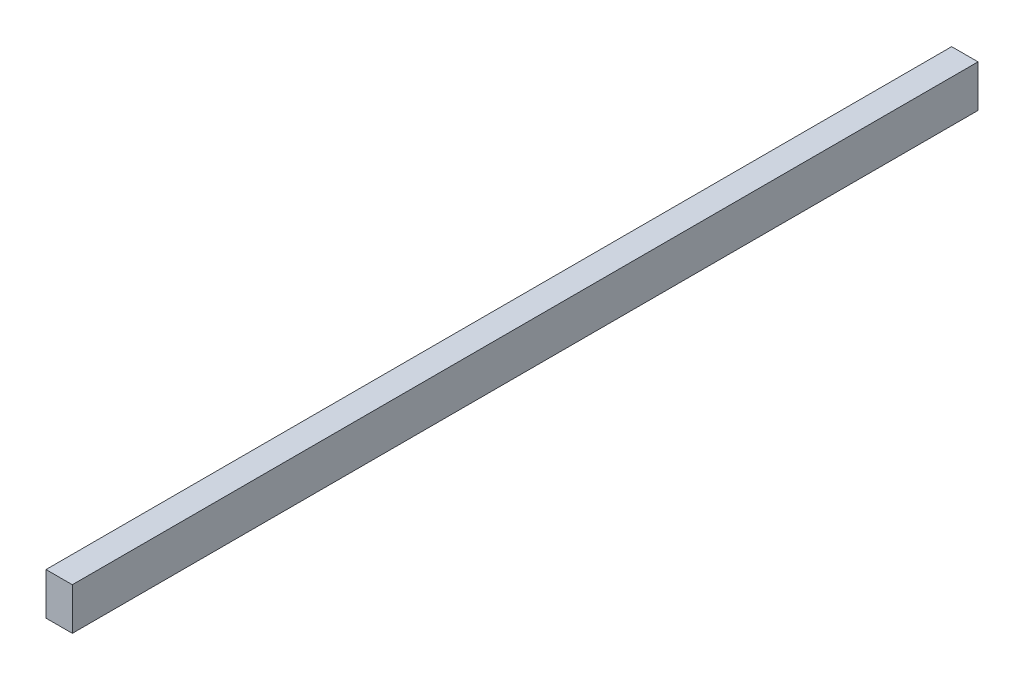
ISO-10303-21;
HEADER;
FILE_DESCRIPTION(('STEP AP214'),'2;1');
FILE_NAME('part.step','',(''),(''),'','','');
FILE_SCHEMA(('AUTOMOTIVE_DESIGN { 1 0 10303 214 1 1 1 1 }'));
ENDSEC;
DATA;
#1=APPLICATION_CONTEXT('core data for automotive mechanical design processes');
#2=APPLICATION_PROTOCOL_DEFINITION('international standard','automotive_design',2000,#1);
#3=PRODUCT_CONTEXT('',#1,'mechanical');
#4=PRODUCT('Part','Part','',(#3));
#5=PRODUCT_RELATED_PRODUCT_CATEGORY('part','',(#4));
#6=PRODUCT_DEFINITION_FORMATION('','',#4);
#7=PRODUCT_DEFINITION_CONTEXT('part definition',#1,'design');
#8=PRODUCT_DEFINITION('design','',#6,#7);
#9=PRODUCT_DEFINITION_SHAPE('','',#8);
#10=(LENGTH_UNIT() NAMED_UNIT(*) SI_UNIT(.MILLI.,.METRE.));
#11=(NAMED_UNIT(*) PLANE_ANGLE_UNIT() SI_UNIT($,.RADIAN.));
#12=(NAMED_UNIT(*) SI_UNIT($,.STERADIAN.) SOLID_ANGLE_UNIT());
#13=UNCERTAINTY_MEASURE_WITH_UNIT(LENGTH_MEASURE(1.E-05),#10,'distance_accuracy_value','');
#14=(GEOMETRIC_REPRESENTATION_CONTEXT(3) GLOBAL_UNCERTAINTY_ASSIGNED_CONTEXT((#13)) GLOBAL_UNIT_ASSIGNED_CONTEXT((#10,
#11,#12)) REPRESENTATION_CONTEXT('',''));
#15=CARTESIAN_POINT('',(0.,0.,0.));
#16=DIRECTION('',(0.,0.,1.));
#17=DIRECTION('',(1.,0.,0.));
#18=AXIS2_PLACEMENT_3D('',#15,#16,#17);
#19=CARTESIAN_POINT('',(12.5,40.,430.));
#20=DIRECTION('',(-1.,0.,0.));
#21=DIRECTION('',(0.,0.,1.));
#22=AXIS2_PLACEMENT_3D('',#19,#20,#21);
#23=PLANE('',#22);
#24=DIRECTION('',(0.,0.,-1.));
#25=VECTOR('',#24,1.);
#26=CARTESIAN_POINT('',(12.5,0.,430.));
#27=LINE('',#26,#25);
#28=CARTESIAN_POINT('',(12.5,0.,430.));
#29=VERTEX_POINT('',#28);
#30=CARTESIAN_POINT('',(12.5,0.,-430.));
#31=VERTEX_POINT('',#30);
#32=EDGE_CURVE('E102',#29,#31,#27,.T.);
#33=ORIENTED_EDGE('',*,*,#32,.T.);
#34=DIRECTION('',(0.,-1.,0.));
#35=VECTOR('',#34,1.);
#36=CARTESIAN_POINT('',(12.5,40.,-430.));
#37=LINE('',#36,#35);
#38=CARTESIAN_POINT('',(12.5,40.,-430.));
#39=VERTEX_POINT('',#38);
#40=EDGE_CURVE('E11',#39,#31,#37,.T.);
#41=ORIENTED_EDGE('',*,*,#40,.F.);
#42=DIRECTION('',(0.,0.,-1.));
#43=VECTOR('',#42,1.);
#44=CARTESIAN_POINT('',(12.5,40.,430.));
#45=LINE('',#44,#43);
#46=CARTESIAN_POINT('',(12.5,40.,430.));
#47=VERTEX_POINT('',#46);
#48=EDGE_CURVE('E90',#47,#39,#45,.T.);
#49=ORIENTED_EDGE('',*,*,#48,.F.);
#50=DIRECTION('',(0.,-1.,0.));
#51=VECTOR('',#50,1.);
#52=CARTESIAN_POINT('',(12.5,40.,430.));
#53=LINE('',#52,#51);
#54=EDGE_CURVE('E98',#47,#29,#53,.T.);
#55=ORIENTED_EDGE('',*,*,#54,.T.);
#56=EDGE_LOOP('',(#33,#41,#49,#55));
#57=FACE_BOUND('',#56,.T.);
#58=ADVANCED_FACE('F39',(#57),#23,.F.);
#59=CARTESIAN_POINT('',(-12.5,40.,-430.));
#60=DIRECTION('',(0.,0.,1.));
#61=DIRECTION('',(1.,0.,0.));
#62=AXIS2_PLACEMENT_3D('',#59,#60,#61);
#63=PLANE('',#62);
#64=DIRECTION('',(-1.,0.,0.));
#65=VECTOR('',#64,1.);
#66=CARTESIAN_POINT('',(-12.5,0.,-430.));
#67=LINE('',#66,#65);
#68=CARTESIAN_POINT('',(-12.5,0.,-430.));
#69=VERTEX_POINT('',#68);
#70=EDGE_CURVE('E94',#31,#69,#67,.T.);
#71=ORIENTED_EDGE('',*,*,#70,.T.);
#72=DIRECTION('',(0.,-1.,0.));
#73=VECTOR('',#72,1.);
#74=CARTESIAN_POINT('',(-12.5,40.,-430.));
#75=LINE('',#74,#73);
#76=CARTESIAN_POINT('',(-12.5,40.,-430.));
#77=VERTEX_POINT('',#76);
#78=EDGE_CURVE('E47',#77,#69,#75,.T.);
#79=ORIENTED_EDGE('',*,*,#78,.F.);
#80=DIRECTION('',(-1.,0.,0.));
#81=VECTOR('',#80,1.);
#82=CARTESIAN_POINT('',(-12.5,40.,-430.));
#83=LINE('',#82,#81);
#84=EDGE_CURVE('E85',#39,#77,#83,.T.);
#85=ORIENTED_EDGE('',*,*,#84,.F.);
#86=ORIENTED_EDGE('',*,*,#40,.T.);
#87=EDGE_LOOP('',(#71,#79,#85,#86));
#88=FACE_BOUND('',#87,.T.);
#89=ADVANCED_FACE('F93',(#88),#63,.F.);
#90=CARTESIAN_POINT('',(-12.5,40.,430.));
#91=DIRECTION('',(1.,0.,0.));
#92=DIRECTION('',(0.,0.,-1.));
#93=AXIS2_PLACEMENT_3D('',#90,#91,#92);
#94=PLANE('',#93);
#95=DIRECTION('',(0.,0.,1.));
#96=VECTOR('',#95,1.);
#97=CARTESIAN_POINT('',(-12.5,0.,430.));
#98=LINE('',#97,#96);
#99=CARTESIAN_POINT('',(-12.5,0.,430.));
#100=VERTEX_POINT('',#99);
#101=EDGE_CURVE('E72',#69,#100,#98,.T.);
#102=ORIENTED_EDGE('',*,*,#101,.T.);
#103=DIRECTION('',(0.,-1.,0.));
#104=VECTOR('',#103,1.);
#105=CARTESIAN_POINT('',(-12.5,40.,430.));
#106=LINE('',#105,#104);
#107=CARTESIAN_POINT('',(-12.5,40.,430.));
#108=VERTEX_POINT('',#107);
#109=EDGE_CURVE('E95',#108,#100,#106,.T.);
#110=ORIENTED_EDGE('',*,*,#109,.F.);
#111=DIRECTION('',(0.,0.,1.));
#112=VECTOR('',#111,1.);
#113=CARTESIAN_POINT('',(-12.5,40.,430.));
#114=LINE('',#113,#112);
#115=EDGE_CURVE('E88',#77,#108,#114,.T.);
#116=ORIENTED_EDGE('',*,*,#115,.F.);
#117=ORIENTED_EDGE('',*,*,#78,.T.);
#118=EDGE_LOOP('',(#102,#110,#116,#117));
#119=FACE_BOUND('',#118,.T.);
#120=ADVANCED_FACE('F96',(#119),#94,.F.);
#121=CARTESIAN_POINT('',(-12.5,40.,430.));
#122=DIRECTION('',(0.,0.,-1.));
#123=DIRECTION('',(-1.,0.,0.));
#124=AXIS2_PLACEMENT_3D('',#121,#122,#123);
#125=PLANE('',#124);
#126=DIRECTION('',(1.,0.,0.));
#127=VECTOR('',#126,1.);
#128=CARTESIAN_POINT('',(-12.5,0.,430.));
#129=LINE('',#128,#127);
#130=EDGE_CURVE('E78',#100,#29,#129,.T.);
#131=ORIENTED_EDGE('',*,*,#130,.T.);
#132=ORIENTED_EDGE('',*,*,#54,.F.);
#133=DIRECTION('',(1.,0.,0.));
#134=VECTOR('',#133,1.);
#135=CARTESIAN_POINT('',(-12.5,40.,430.));
#136=LINE('',#135,#134);
#137=EDGE_CURVE('E55',#108,#47,#136,.T.);
#138=ORIENTED_EDGE('',*,*,#137,.F.);
#139=ORIENTED_EDGE('',*,*,#109,.T.);
#140=EDGE_LOOP('',(#131,#132,#138,#139));
#141=FACE_BOUND('',#140,.T.);
#142=ADVANCED_FACE('F109',(#141),#125,.F.);
#143=CARTESIAN_POINT('',(0.,40.,0.));
#144=DIRECTION('',(0.,-1.,0.));
#145=DIRECTION('',(0.,0.,-1.));
#146=AXIS2_PLACEMENT_3D('',#143,#144,#145);
#147=PLANE('',#146);
#148=ORIENTED_EDGE('',*,*,#48,.T.);
#149=ORIENTED_EDGE('',*,*,#84,.T.);
#150=ORIENTED_EDGE('',*,*,#115,.T.);
#151=ORIENTED_EDGE('',*,*,#137,.T.);
#152=EDGE_LOOP('',(#148,#149,#150,#151));
#153=FACE_BOUND('',#152,.T.);
#154=ADVANCED_FACE('F86',(#153),#147,.F.);
#155=CARTESIAN_POINT('',(0.,0.,0.));
#156=DIRECTION('',(0.,-1.,0.));
#157=DIRECTION('',(0.,0.,-1.));
#158=AXIS2_PLACEMENT_3D('',#155,#156,#157);
#159=PLANE('',#158);
#160=ORIENTED_EDGE('',*,*,#32,.F.);
#161=ORIENTED_EDGE('',*,*,#130,.F.);
#162=ORIENTED_EDGE('',*,*,#101,.F.);
#163=ORIENTED_EDGE('',*,*,#70,.F.);
#164=EDGE_LOOP('',(#160,#161,#162,#163));
#165=FACE_BOUND('',#164,.T.);
#166=ADVANCED_FACE('F112',(#165),#159,.T.);
#167=CLOSED_SHELL('',(#58,#89,#120,#142,#154,#166));
#168=MANIFOLD_SOLID_BREP('B2',#167);
#169=ADVANCED_BREP_SHAPE_REPRESENTATION('',(#18,#168),#14);
#170=SHAPE_DEFINITION_REPRESENTATION(#9,#169);
ENDSEC;
END-ISO-10303-21;
